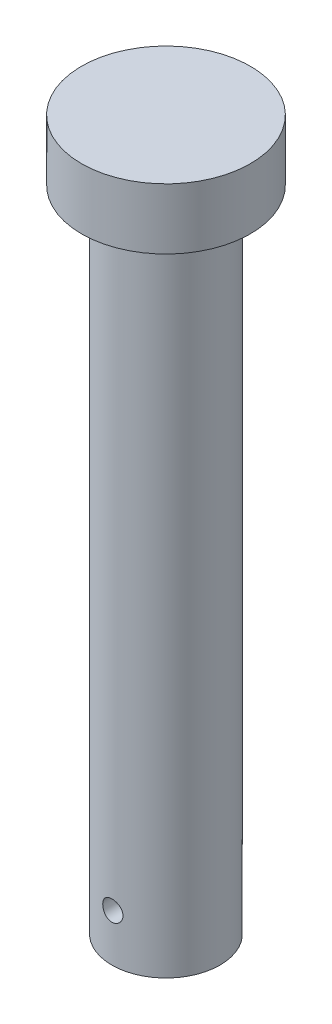
ISO-10303-21;
HEADER;
FILE_DESCRIPTION(('STEP AP214'),'2;1');
FILE_NAME('part.step','',(''),(''),'','','');
FILE_SCHEMA(('AUTOMOTIVE_DESIGN { 1 0 10303 214 1 1 1 1 }'));
ENDSEC;
DATA;
#1=APPLICATION_CONTEXT('core data for automotive mechanical design processes');
#2=APPLICATION_PROTOCOL_DEFINITION('international standard','automotive_design',2000,#1);
#3=PRODUCT_CONTEXT('',#1,'mechanical');
#4=PRODUCT('Part','Part','',(#3));
#5=PRODUCT_RELATED_PRODUCT_CATEGORY('part','',(#4));
#6=PRODUCT_DEFINITION_FORMATION('','',#4);
#7=PRODUCT_DEFINITION_CONTEXT('part definition',#1,'design');
#8=PRODUCT_DEFINITION('design','',#6,#7);
#9=PRODUCT_DEFINITION_SHAPE('','',#8);
#10=(LENGTH_UNIT() NAMED_UNIT(*) SI_UNIT(.MILLI.,.METRE.));
#11=(NAMED_UNIT(*) PLANE_ANGLE_UNIT() SI_UNIT($,.RADIAN.));
#12=(NAMED_UNIT(*) SI_UNIT($,.STERADIAN.) SOLID_ANGLE_UNIT());
#13=UNCERTAINTY_MEASURE_WITH_UNIT(LENGTH_MEASURE(1.E-05),#10,'distance_accuracy_value','');
#14=(GEOMETRIC_REPRESENTATION_CONTEXT(3) GLOBAL_UNCERTAINTY_ASSIGNED_CONTEXT((#13)) GLOBAL_UNIT_ASSIGNED_CONTEXT((#10,
#11,#12)) REPRESENTATION_CONTEXT('',''));
#15=CARTESIAN_POINT('',(0.,0.,0.));
#16=DIRECTION('',(0.,0.,1.));
#17=DIRECTION('',(1.,0.,0.));
#18=AXIS2_PLACEMENT_3D('',#15,#16,#17);
#19=CARTESIAN_POINT('',(0.,9.,0.));
#20=DIRECTION('',(0.,-1.,0.));
#21=DIRECTION('',(0.,0.,-1.));
#22=AXIS2_PLACEMENT_3D('',#19,#20,#21);
#23=CYLINDRICAL_SURFACE('',#22,12.5);
#24=CARTESIAN_POINT('',(0.,9.,0.));
#25=DIRECTION('',(0.,1.,0.));
#26=DIRECTION('',(0.,0.,1.));
#27=AXIS2_PLACEMENT_3D('',#24,#25,#26);
#28=CIRCLE('',#27,12.5);
#29=CARTESIAN_POINT('',(0.,9.,12.5));
#30=VERTEX_POINT('',#29);
#31=EDGE_CURVE('E42',#30,#30,#28,.T.);
#32=ORIENTED_EDGE('',*,*,#31,.F.);
#33=EDGE_LOOP('',(#32));
#34=FACE_BOUND('',#33,.T.);
#35=CARTESIAN_POINT('',(0.,0.,0.));
#36=DIRECTION('',(0.,1.,0.));
#37=DIRECTION('',(0.,0.,1.));
#38=AXIS2_PLACEMENT_3D('',#35,#36,#37);
#39=CIRCLE('',#38,12.5);
#40=CARTESIAN_POINT('',(0.,0.,12.5));
#41=VERTEX_POINT('',#40);
#42=EDGE_CURVE('E47',#41,#41,#39,.T.);
#43=ORIENTED_EDGE('',*,*,#42,.T.);
#44=EDGE_LOOP('',(#43));
#45=FACE_BOUND('',#44,.T.);
#46=ADVANCED_FACE('F31',(#34,#45),#23,.T.);
#47=CARTESIAN_POINT('',(0.,9.,0.));
#48=DIRECTION('',(0.,1.,0.));
#49=DIRECTION('',(0.,0.,1.));
#50=AXIS2_PLACEMENT_3D('',#47,#48,#49);
#51=PLANE('',#50);
#52=ORIENTED_EDGE('',*,*,#31,.T.);
#53=EDGE_LOOP('',(#52));
#54=FACE_BOUND('',#53,.T.);
#55=ADVANCED_FACE('F73',(#54),#51,.T.);
#56=CARTESIAN_POINT('',(0.,0.,0.));
#57=DIRECTION('',(0.,1.,0.));
#58=DIRECTION('',(0.,0.,1.));
#59=AXIS2_PLACEMENT_3D('',#56,#57,#58);
#60=PLANE('',#59);
#61=CARTESIAN_POINT('',(0.,0.,0.));
#62=DIRECTION('',(0.,1.,0.));
#63=DIRECTION('',(0.,0.,1.));
#64=AXIS2_PLACEMENT_3D('',#61,#62,#63);
#65=CIRCLE('',#64,8.);
#66=CARTESIAN_POINT('',(0.,0.,8.));
#67=VERTEX_POINT('',#66);
#68=EDGE_CURVE('E10',#67,#67,#65,.F.);
#69=ORIENTED_EDGE('',*,*,#68,.F.);
#70=EDGE_LOOP('',(#69));
#71=FACE_BOUND('',#70,.T.);
#72=ORIENTED_EDGE('',*,*,#42,.F.);
#73=EDGE_LOOP('',(#72));
#74=FACE_BOUND('',#73,.T.);
#75=ADVANCED_FACE('F69',(#71,#74),#60,.F.);
#76=CARTESIAN_POINT('',(0.,-96.,0.));
#77=DIRECTION('',(0.,1.,0.));
#78=DIRECTION('',(0.,0.,1.));
#79=AXIS2_PLACEMENT_3D('',#76,#77,#78);
#80=CYLINDRICAL_SURFACE('',#79,8.);
#81=CARTESIAN_POINT('',(0.,-90.5,8.));
#82=CARTESIAN_POINT('',(-0.0834717464654713,-90.4999968104117,7.99999848833852));
#83=CARTESIAN_POINT('',(-0.166984992730099,-90.4930089233806,7.99868009921714));
#84=CARTESIAN_POINT('',(-0.331658129841798,-90.4652600048817,7.9935478589052));
#85=CARTESIAN_POINT('',(-0.412815974152226,-90.4444873493603,7.98973190166897));
#86=CARTESIAN_POINT('',(-0.570372961851802,-90.3898272987407,7.98003138765458));
#87=CARTESIAN_POINT('',(-0.646776330685345,-90.3559517475475,7.97414869946483));
#88=CARTESIAN_POINT('',(-0.792807973094009,-90.2760811230772,7.96095710599783));
#89=CARTESIAN_POINT('',(-0.862436794477327,-90.2300870308552,7.9536483161829));
#90=CARTESIAN_POINT('',(-0.993783715930506,-90.1267002319963,7.93831336430504));
#91=CARTESIAN_POINT('',(-1.05540895503183,-90.0691905553299,7.93028034856351));
#92=CARTESIAN_POINT('',(-1.16819606135369,-89.9446566909124,7.9144531845865));
#93=CARTESIAN_POINT('',(-1.21935717689242,-89.8776318202307,7.90665905354528));
#94=CARTESIAN_POINT('',(-1.31014998665793,-89.735313911636,7.89212551245006));
#95=CARTESIAN_POINT('',(-1.34968721969605,-89.6599596296828,7.88539493886182));
#96=CARTESIAN_POINT('',(-1.41550524332283,-89.5035310848232,7.87384713211987));
#97=CARTESIAN_POINT('',(-1.44178717713098,-89.4224573158888,7.86902973396962));
#98=CARTESIAN_POINT('',(-1.480050535035,-89.2578847690856,7.8619226957455));
#99=CARTESIAN_POINT('',(-1.49219390192039,-89.1744249027965,7.85960445366405));
#100=CARTESIAN_POINT('',(-1.50233808095346,-89.0066226151917,7.85767197152761));
#101=CARTESIAN_POINT('',(-1.50034016135374,-88.9222802736977,7.8580574889876));
#102=CARTESIAN_POINT('',(-1.48238979602363,-88.7562804747339,7.86146292701753));
#103=CARTESIAN_POINT('',(-1.46662149996045,-88.6746022856998,7.86444808147334));
#104=CARTESIAN_POINT('',(-1.42186799396207,-88.5150715802174,7.87266183284666));
#105=CARTESIAN_POINT('',(-1.39288222239499,-88.4372192264907,7.87789052509516));
#106=CARTESIAN_POINT('',(-1.322336471793,-88.2870113209997,7.89003855292588));
#107=CARTESIAN_POINT('',(-1.28070213532456,-88.2146915294192,7.89696783823366));
#108=CARTESIAN_POINT('',(-1.18609368930417,-88.0779952714598,7.91172971602918));
#109=CARTESIAN_POINT('',(-1.13311842889266,-88.0136196122852,7.91956240015522));
#110=CARTESIAN_POINT('',(-1.01633905685297,-87.8935750443275,7.93540001272164));
#111=CARTESIAN_POINT('',(-0.95237743686068,-87.8380593475483,7.94340571024031));
#112=CARTESIAN_POINT('',(-0.815968037098826,-87.7385227593246,7.95857386108318));
#113=CARTESIAN_POINT('',(-0.743520172255769,-87.6945019831296,7.96573630595245));
#114=CARTESIAN_POINT('',(-0.592034988874668,-87.61918224613,7.97842539677509));
#115=CARTESIAN_POINT('',(-0.512989564446494,-87.5878992208821,7.98394999136289));
#116=CARTESIAN_POINT('',(-0.350639115398697,-87.5390979069078,7.99272505402719));
#117=CARTESIAN_POINT('',(-0.267334544277787,-87.5215781559546,7.99597576367994));
#118=CARTESIAN_POINT('',(-0.100148652903385,-87.5010139689817,7.99980360641981));
#119=CARTESIAN_POINT('',(-0.016294012634135,-87.4977596084703,8.00041950912279));
#120=CARTESIAN_POINT('',(0.150761248092184,-87.5052554795476,7.99901543598228));
#121=CARTESIAN_POINT('',(0.233961900480386,-87.5160050230652,7.99699558964431));
#122=CARTESIAN_POINT('',(0.396681573218218,-87.5510290351834,7.99057111500406));
#123=CARTESIAN_POINT('',(0.476224261046064,-87.5751972825378,7.98618522374031));
#124=CARTESIAN_POINT('',(0.630128631824634,-87.6362577067788,7.97551842212498));
#125=CARTESIAN_POINT('',(0.704489962595104,-87.6731507475658,7.96923738311334));
#126=CARTESIAN_POINT('',(0.846816671513214,-87.7590781281595,7.95538030357666));
#127=CARTESIAN_POINT('',(0.914703277015121,-87.8082407385368,7.94779086174563));
#128=CARTESIAN_POINT('',(1.04133832326454,-87.9171381373623,7.93219343489712));
#129=CARTESIAN_POINT('',(1.10008590976087,-87.9768739130013,7.92418541084687));
#130=CARTESIAN_POINT('',(1.20757295872048,-88.1061723189114,7.9085247569745));
#131=CARTESIAN_POINT('',(1.25616916218577,-88.1758549081254,7.90087825860257));
#132=CARTESIAN_POINT('',(1.34096675057787,-88.3225176245238,7.88692985578532));
#133=CARTESIAN_POINT('',(1.37716859613925,-88.3994974803705,7.8806279013735));
#134=CARTESIAN_POINT('',(1.43594673512823,-88.5582058672425,7.87013024209574));
#135=CARTESIAN_POINT('',(1.45858868794786,-88.6399093795593,7.86592440436878));
#136=CARTESIAN_POINT('',(1.48980679326236,-88.8060472225214,7.86007203802415));
#137=CARTESIAN_POINT('',(1.49838453270708,-88.8904812439704,7.8584252206579));
#138=CARTESIAN_POINT('',(1.50117762148355,-89.0582483314415,7.85789199803857));
#139=CARTESIAN_POINT('',(1.49561895003499,-89.141577580957,7.85896215974293));
#140=CARTESIAN_POINT('',(1.47079175378803,-89.3060914220453,7.86364600659998));
#141=CARTESIAN_POINT('',(1.45152331089332,-89.3872760264274,7.86725967655747));
#142=CARTESIAN_POINT('',(1.39991887583263,-89.5450744847955,7.8766050802318));
#143=CARTESIAN_POINT('',(1.36760735397253,-89.6216965913458,7.88233284594965));
#144=CARTESIAN_POINT('',(1.29085868912205,-89.7684682542408,7.8952638755184));
#145=CARTESIAN_POINT('',(1.24642068948186,-89.8386173528448,7.90246724360119));
#146=CARTESIAN_POINT('',(1.14589487339536,-89.9715836800423,7.91767266107745));
#147=CARTESIAN_POINT('',(1.08964259864304,-90.0342754125671,7.92568505353043));
#148=CARTESIAN_POINT('',(0.967427926742297,-90.1494051624645,7.94152833918735));
#149=CARTESIAN_POINT('',(0.901463301891622,-90.2018408209801,7.94935919027328));
#150=CARTESIAN_POINT('',(0.760984945071879,-90.2954109526271,7.96403975968049));
#151=CARTESIAN_POINT('',(0.686399590640521,-90.3364394284906,7.97088000990561));
#152=CARTESIAN_POINT('',(0.531290113653833,-90.4053176366051,7.98271619380687));
#153=CARTESIAN_POINT('',(0.450771651705244,-90.4331797470469,7.98771385879037));
#154=CARTESIAN_POINT('',(0.30834720282515,-90.4692773144187,7.99428290707632));
#155=CARTESIAN_POINT('',(0.247273810251869,-90.4807786303128,7.99641470878206));
#156=CARTESIAN_POINT('',(0.124141247115158,-90.4961410621165,7.9992737995401));
#157=CARTESIAN_POINT('',(0.0620821016527093,-90.5000023722559,8.00000112429805));
#158=CARTESIAN_POINT('',(0.,-90.5,8.));
#159=B_SPLINE_CURVE_WITH_KNOTS('',3,(#81,#82,#83,#84,#85,#86,#87,#88,#89,#90,#91,#92,#93,#94,
#95,#96,#97,#98,#99,#100,#101,#102,#103,#104,#105,#106,#107,#108,#109,#110,#111,#112,#113,#114,
#115,#116,#117,#118,#119,#120,#121,#122,#123,#124,#125,#126,#127,#128,#129,#130,#131,#132,#133,
#134,#135,#136,#137,#138,#139,#140,#141,#142,#143,#144,#145,#146,#147,#148,#149,#150,#151,#152,
#153,#154,#155,#156,#157,#158),.UNSPECIFIED.,.T.,.F.,(4,2,2,2,2,2,2,2,2,2,2,2,2,2,2,2,2,2,2,2,2,
2,2,2,2,2,2,2,2,2,2,2,2,2,2,2,2,2,4),(0.,0.250188200964924,0.500587642535454,0.75076127123091,
1.00091465336891,1.25375118013631,1.50660586283617,1.76146190504358,2.01629596311949,
2.26818151445337,2.52004447587256,2.76859000612767,3.01714609846787,3.2671926262953,
3.5172645404986,3.77127768464077,4.02529337544948,4.27962588321699,4.53393136673746,
4.78448174076097,5.03501980464584,5.28360233907829,5.53220175338032,5.78351778017709,
6.03485728413098,6.28953436987301,6.54420198954947,6.79762627818561,7.05102196946514,
7.30039252231748,7.54976158541506,7.79866496207693,8.04758592655422,8.3002336996638,
8.55293951262255,8.80792048916315,9.06266126931174,9.2487434452441,9.43482089039541),.UNSPECIFIED.);
#160=CARTESIAN_POINT('',(0.,-90.5,8.));
#161=VERTEX_POINT('',#160);
#162=EDGE_CURVE('E34',#161,#161,#159,.T.);
#163=ORIENTED_EDGE('',*,*,#162,.T.);
#164=EDGE_LOOP('',(#163));
#165=FACE_BOUND('',#164,.T.);
#166=CARTESIAN_POINT('',(1.5,-89.,-7.85811682275086));
#167=CARTESIAN_POINT('',(1.49999679883246,-88.9165427919882,-7.85811843793493));
#168=CARTESIAN_POINT('',(1.49301126348936,-88.8330440517816,-7.85946079760266));
#169=CARTESIAN_POINT('',(1.46527253251805,-88.6684010384181,-7.86467851014364));
#170=CARTESIAN_POINT('',(1.44450765768477,-88.5872588235725,-7.86855601173205));
#171=CARTESIAN_POINT('',(1.38987035617788,-88.4297349286291,-7.87838976464885));
#172=CARTESIAN_POINT('',(1.35601013954374,-88.3533488906927,-7.88434407905997));
#173=CARTESIAN_POINT('',(1.27617565760366,-88.2073464407132,-7.89765826320959));
#174=CARTESIAN_POINT('',(1.23020233759194,-88.1377295009967,-7.90501802325622));
#175=CARTESIAN_POINT('',(1.12683678942623,-88.0063698008009,-7.92041614838945));
#176=CARTESIAN_POINT('',(1.06932292933092,-87.9447235165283,-7.92846116625679));
#177=CARTESIAN_POINT('',(0.944771778803549,-87.8318956104004,-7.94426457664034));
#178=CARTESIAN_POINT('',(0.877733863624942,-87.7807146755752,-7.95202295031153));
#179=CARTESIAN_POINT('',(0.735403894570159,-87.6899006233995,-7.96645017828405));
#180=CARTESIAN_POINT('',(0.660052840033861,-87.6503584664806,-7.97311028052363));
#181=CARTESIAN_POINT('',(0.503631283250756,-87.5845304577265,-7.98451608632931));
#182=CARTESIAN_POINT('',(0.4225612518595,-87.5582435160098,-7.98926194728334));
#183=CARTESIAN_POINT('',(0.258002746187411,-87.5199704513889,-7.99625755123778));
#184=CARTESIAN_POINT('',(0.174553323244854,-87.5078216940773,-7.99853565976327));
#185=CARTESIAN_POINT('',(0.00677167603538331,-87.4976631122996,-8.00043684615594));
#186=CARTESIAN_POINT('',(-0.0775604724476686,-87.4996520838609,-8.00006015010697));
#187=CARTESIAN_POINT('',(-0.243598357899393,-87.5175877711471,-7.99671633763241));
#188=CARTESIAN_POINT('',(-0.325323760451465,-87.53335936943,-7.99378172247214));
#189=CARTESIAN_POINT('',(-0.484947165715472,-87.5781356493952,-7.98568826333561));
#190=CARTESIAN_POINT('',(-0.562845028826539,-87.6071408133458,-7.98052933829966));
#191=CARTESIAN_POINT('',(-0.71311006575152,-87.6777277310583,-7.96851260297339));
#192=CARTESIAN_POINT('',(-0.785443571838529,-87.7193794879125,-7.96164537590825));
#193=CARTESIAN_POINT('',(-0.922159977214636,-87.8140256690771,-7.9469714754285));
#194=CARTESIAN_POINT('',(-0.986542066910786,-87.8670212468876,-7.93916470651164));
#195=CARTESIAN_POINT('',(-1.10656561896904,-87.9838157029835,-7.92333513680567));
#196=CARTESIAN_POINT('',(-1.16205790757041,-88.0477677839021,-7.91531085901621));
#197=CARTESIAN_POINT('',(-1.26155171851261,-88.1841495312786,-7.90006508924621));
#198=CARTESIAN_POINT('',(-1.30555307271182,-88.2565793217646,-7.89284360901351));
#199=CARTESIAN_POINT('',(-1.38085852224478,-88.4080582707027,-7.88001893307121));
#200=CARTESIAN_POINT('',(-1.41214093645421,-88.4871184571906,-7.87441850530261));
#201=CARTESIAN_POINT('',(-1.46093656975056,-88.6495011841232,-7.86551242396689));
#202=CARTESIAN_POINT('',(-1.47845134901108,-88.7328232404648,-7.8622065103862));
#203=CARTESIAN_POINT('',(-1.49899672649739,-88.9000193288559,-7.85831520301005));
#204=CARTESIAN_POINT('',(-1.50224164285859,-88.9838661155655,-7.85768955816136));
#205=CARTESIAN_POINT('',(-1.49472968881725,-89.1509034550871,-7.8591219142084));
#206=CARTESIAN_POINT('',(-1.48397351086433,-89.2340940401481,-7.86117978238611));
#207=CARTESIAN_POINT('',(-1.44894868195883,-89.3967529030544,-7.86770980063205));
#208=CARTESIAN_POINT('',(-1.42479238583989,-89.4762462526249,-7.87216186690879));
#209=CARTESIAN_POINT('',(-1.3637722437906,-89.6300571897302,-7.88296134156619));
#210=CARTESIAN_POINT('',(-1.32690746128795,-89.7043743953153,-7.88930888963281));
#211=CARTESIAN_POINT('',(-1.2410235311966,-89.8466676190432,-7.90327577863685));
#212=CARTESIAN_POINT('',(-1.19186899639621,-89.9145605378661,-7.91090895425315));
#213=CARTESIAN_POINT('',(-1.08298344344246,-90.0412120402143,-7.926548113681));
#214=CARTESIAN_POINT('',(-1.02325147433084,-90.0999698015558,-7.93455413096494));
#215=CARTESIAN_POINT('',(-0.893949417870389,-90.2074837635341,-7.95016624005946));
#216=CARTESIAN_POINT('',(-0.824258534095892,-90.256095826606,-7.95776555833305));
#217=CARTESIAN_POINT('',(-0.677574523040141,-90.3409212061777,-7.97159404810351));
#218=CARTESIAN_POINT('',(-0.60058167703853,-90.377135000025,-7.97782327234725));
#219=CARTESIAN_POINT('',(-0.441877541578686,-90.4359200978641,-7.98818057995848));
#220=CARTESIAN_POINT('',(-0.360193213078988,-90.4585621875614,-7.99231954730142));
#221=CARTESIAN_POINT('',(-0.194096227381572,-90.4897870482899,-7.99807642083745));
#222=CARTESIAN_POINT('',(-0.109683858215854,-90.4983712986627,-7.99969459229933));
#223=CARTESIAN_POINT('',(0.0580907602505049,-90.5011853015184,-8.00022227515441));
#224=CARTESIAN_POINT('',(0.141449307066264,-90.4956327531295,-7.99917286625032));
#225=CARTESIAN_POINT('',(0.306023369279196,-90.4708075722316,-7.99456866611703));
#226=CARTESIAN_POINT('',(0.387238905213687,-90.4515350712558,-7.99101389890671));
#227=CARTESIAN_POINT('',(0.545106475595482,-90.3999087926163,-7.98179837978045));
#228=CARTESIAN_POINT('',(0.621766319318221,-90.367578187119,-7.97614135981576));
#229=CARTESIAN_POINT('',(0.76860563131669,-90.2907795463448,-7.96333372068771));
#230=CARTESIAN_POINT('',(0.838784665003266,-90.2463106978933,-7.95618300146483));
#231=CARTESIAN_POINT('',(0.971755027780004,-90.1457485455577,-7.94104779859941));
#232=CARTESIAN_POINT('',(1.03442623539053,-90.0894979661383,-7.93305284591272));
#233=CARTESIAN_POINT('',(1.14951536065485,-89.9672954375073,-7.91719633538833));
#234=CARTESIAN_POINT('',(1.2019308632478,-89.9013412096263,-7.90933480936764));
#235=CARTESIAN_POINT('',(1.29547633945385,-89.7608735452966,-7.89455577425925));
#236=CARTESIAN_POINT('',(1.33649740531872,-89.6862865603323,-7.88764767280728));
#237=CARTESIAN_POINT('',(1.40536132423417,-89.5311742100202,-7.87567084650033));
#238=CARTESIAN_POINT('',(1.43321661638913,-89.4506545334106,-7.87060038649116));
#239=CARTESIAN_POINT('',(1.46929726596176,-89.3082477119341,-7.86393016292125));
#240=CARTESIAN_POINT('',(1.48079105739851,-89.247194276238,-7.86176310717932));
#241=CARTESIAN_POINT('',(1.49614351076215,-89.1241015315797,-7.85885585595504));
#242=CARTESIAN_POINT('',(1.50000238052127,-89.0620622494997,-7.85811562163283));
#243=CARTESIAN_POINT('',(1.5,-89.,-7.85811682275086));
#244=B_SPLINE_CURVE_WITH_KNOTS('',3,(#166,#167,#168,#169,#170,#171,#172,#173,#174,#175,#176,
#177,#178,#179,#180,#181,#182,#183,#184,#185,#186,#187,#188,#189,#190,#191,#192,#193,#194,#195,
#196,#197,#198,#199,#200,#201,#202,#203,#204,#205,#206,#207,#208,#209,#210,#211,#212,#213,#214,
#215,#216,#217,#218,#219,#220,#221,#222,#223,#224,#225,#226,#227,#228,#229,#230,#231,#232,#233,
#234,#235,#236,#237,#238,#239,#240,#241,#242,#243),.UNSPECIFIED.,.T.,.F.,(4,2,2,2,2,2,2,2,2,2,2,
2,2,2,2,2,2,2,2,2,2,2,2,2,2,2,2,2,2,2,2,2,2,2,2,2,2,2,4),(0.,0.250144505793196,
0.500501302380392,0.750625227978433,1.00072963993908,1.25362335698692,1.50653367069316,
1.76137104348048,2.01618745939641,2.26804275460261,2.51987660200648,2.76855650598725,
3.01724547328424,3.26733691984219,3.51745380911786,3.77140614764065,4.02536220192401,
4.27974936118267,4.53410768866487,4.78463248587074,5.03514489338718,5.28358792315368,
5.53204926624319,5.78337862654145,6.03473059394677,6.2894412549587,6.54414210821706,
6.79750269418683,7.0508366166733,7.30029300570138,7.54974700322168,7.79876026530358,
8.0477902135711,8.30038464008745,8.55303847730766,8.80803001818121,9.06278015749121,
9.24880307527216,9.43482092920426),.UNSPECIFIED.);
#245=CARTESIAN_POINT('',(1.5,-89.,-7.85811682275086));
#246=VERTEX_POINT('',#245);
#247=EDGE_CURVE('E50',#246,#246,#244,.T.);
#248=ORIENTED_EDGE('',*,*,#247,.T.);
#249=EDGE_LOOP('',(#248));
#250=FACE_BOUND('',#249,.T.);
#251=CARTESIAN_POINT('',(0.,-96.,0.));
#252=DIRECTION('',(0.,-1.,0.));
#253=DIRECTION('',(0.,0.,-1.));
#254=AXIS2_PLACEMENT_3D('',#251,#252,#253);
#255=CIRCLE('',#254,8.);
#256=CARTESIAN_POINT('',(0.,-96.,-8.));
#257=VERTEX_POINT('',#256);
#258=EDGE_CURVE('E84',#257,#257,#255,.T.);
#259=ORIENTED_EDGE('',*,*,#258,.F.);
#260=EDGE_LOOP('',(#259));
#261=FACE_BOUND('',#260,.T.);
#262=ORIENTED_EDGE('',*,*,#68,.T.);
#263=EDGE_LOOP('',(#262));
#264=FACE_BOUND('',#263,.T.);
#265=ADVANCED_FACE('F54',(#165,#250,#261,#264),#80,.T.);
#266=CARTESIAN_POINT('',(0.,-96.,0.));
#267=DIRECTION('',(0.,-1.,0.));
#268=DIRECTION('',(0.,0.,-1.));
#269=AXIS2_PLACEMENT_3D('',#266,#267,#268);
#270=PLANE('',#269);
#271=ORIENTED_EDGE('',*,*,#258,.T.);
#272=EDGE_LOOP('',(#271));
#273=FACE_BOUND('',#272,.T.);
#274=ADVANCED_FACE('F61',(#273),#270,.T.);
#275=CARTESIAN_POINT('',(0.,-89.,-48.));
#276=DIRECTION('',(0.,0.,1.));
#277=DIRECTION('',(1.,0.,0.));
#278=AXIS2_PLACEMENT_3D('',#275,#276,#277);
#279=CYLINDRICAL_SURFACE('',#278,1.5);
#280=ORIENTED_EDGE('',*,*,#247,.F.);
#281=EDGE_LOOP('',(#280));
#282=FACE_BOUND('',#281,.T.);
#283=ORIENTED_EDGE('',*,*,#162,.F.);
#284=EDGE_LOOP('',(#283));
#285=FACE_BOUND('',#284,.T.);
#286=ADVANCED_FACE('F58',(#282,#285),#279,.F.);
#287=CLOSED_SHELL('',(#46,#55,#75,#265,#274,#286));
#288=MANIFOLD_SOLID_BREP('B2',#287);
#289=ADVANCED_BREP_SHAPE_REPRESENTATION('',(#18,#288),#14);
#290=SHAPE_DEFINITION_REPRESENTATION(#9,#289);
ENDSEC;
END-ISO-10303-21;
